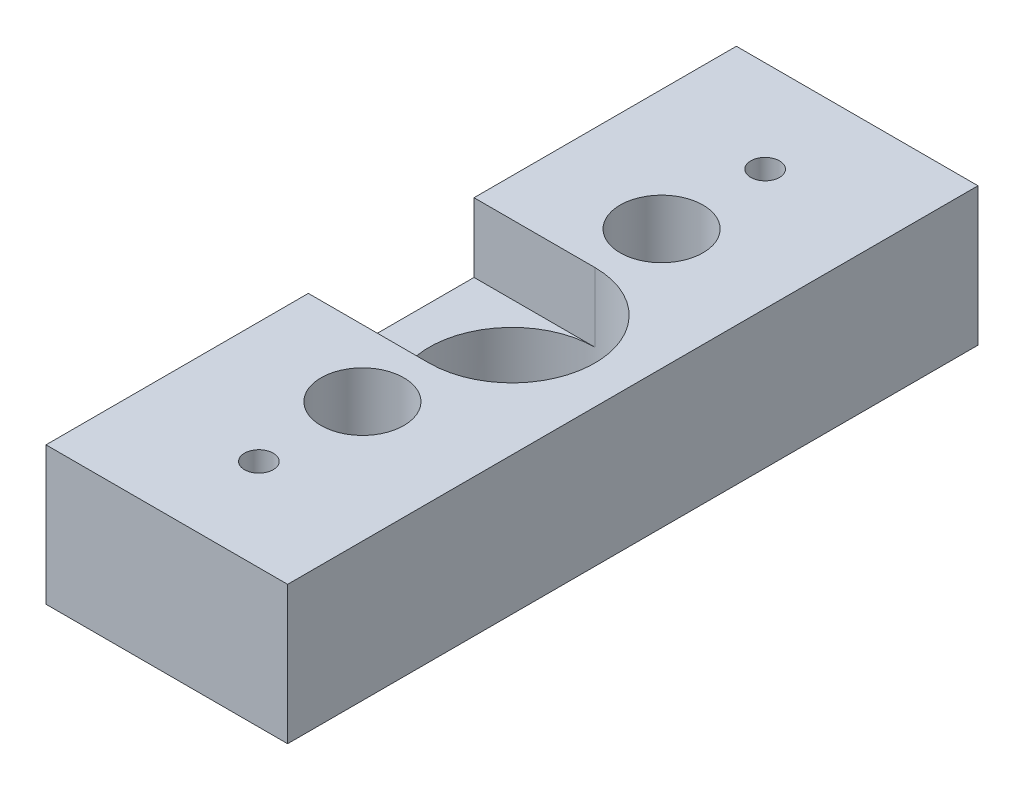
ISO-10303-21;
HEADER;
FILE_DESCRIPTION(('STEP AP214'),'2;1');
FILE_NAME('part.step','',(''),(''),'','','');
FILE_SCHEMA(('AUTOMOTIVE_DESIGN { 1 0 10303 214 1 1 1 1 }'));
ENDSEC;
DATA;
#1=APPLICATION_CONTEXT('core data for automotive mechanical design processes');
#2=APPLICATION_PROTOCOL_DEFINITION('international standard','automotive_design',2000,#1);
#3=PRODUCT_CONTEXT('',#1,'mechanical');
#4=PRODUCT('Part','Part','',(#3));
#5=PRODUCT_RELATED_PRODUCT_CATEGORY('part','',(#4));
#6=PRODUCT_DEFINITION_FORMATION('','',#4);
#7=PRODUCT_DEFINITION_CONTEXT('part definition',#1,'design');
#8=PRODUCT_DEFINITION('design','',#6,#7);
#9=PRODUCT_DEFINITION_SHAPE('','',#8);
#10=(LENGTH_UNIT() NAMED_UNIT(*) SI_UNIT(.MILLI.,.METRE.));
#11=(NAMED_UNIT(*) PLANE_ANGLE_UNIT() SI_UNIT($,.RADIAN.));
#12=(NAMED_UNIT(*) SI_UNIT($,.STERADIAN.) SOLID_ANGLE_UNIT());
#13=UNCERTAINTY_MEASURE_WITH_UNIT(LENGTH_MEASURE(1.E-05),#10,'distance_accuracy_value','');
#14=(GEOMETRIC_REPRESENTATION_CONTEXT(3) GLOBAL_UNCERTAINTY_ASSIGNED_CONTEXT((#13)) GLOBAL_UNIT_ASSIGNED_CONTEXT((#10,
#11,#12)) REPRESENTATION_CONTEXT('',''));
#15=CARTESIAN_POINT('',(0.,0.,0.));
#16=DIRECTION('',(0.,0.,1.));
#17=DIRECTION('',(1.,0.,0.));
#18=AXIS2_PLACEMENT_3D('',#15,#16,#17);
#19=CARTESIAN_POINT('',(0.750000000000003,0.,-2.));
#20=DIRECTION('',(0.,1.,0.));
#21=DIRECTION('',(0.,0.,1.));
#22=AXIS2_PLACEMENT_3D('',#19,#20,#21);
#23=CYLINDRICAL_SURFACE('',#22,3.6);
#24=CARTESIAN_POINT('',(0.750000000000003,0.,-2.));
#25=DIRECTION('',(0.,1.,0.));
#26=DIRECTION('',(0.,0.,1.));
#27=AXIS2_PLACEMENT_3D('',#24,#25,#26);
#28=CIRCLE('',#27,3.6);
#29=CARTESIAN_POINT('',(0.750000000000003,0.,1.6));
#30=VERTEX_POINT('',#29);
#31=EDGE_CURVE('E156',#30,#30,#28,.T.);
#32=ORIENTED_EDGE('',*,*,#31,.F.);
#33=EDGE_LOOP('',(#32));
#34=FACE_BOUND('',#33,.T.);
#35=DIRECTION('',(0.,1.,0.));
#36=VECTOR('',#35,1.);
#37=CARTESIAN_POINT('',(0.750000000000003,3.,1.6));
#38=LINE('',#37,#36);
#39=CARTESIAN_POINT('',(0.750000000000003,3.,1.6));
#40=VERTEX_POINT('',#39);
#41=CARTESIAN_POINT('',(0.750000000000003,6.,1.6));
#42=VERTEX_POINT('',#41);
#43=EDGE_CURVE('E160',#40,#42,#38,.T.);
#44=ORIENTED_EDGE('',*,*,#43,.T.);
#45=CARTESIAN_POINT('',(0.750000000000003,6.,-2.));
#46=DIRECTION('',(0.,1.,0.));
#47=DIRECTION('',(0.,0.,1.));
#48=AXIS2_PLACEMENT_3D('',#45,#46,#47);
#49=CIRCLE('',#48,3.6);
#50=CARTESIAN_POINT('',(0.750000000000003,6.,-5.6));
#51=VERTEX_POINT('',#50);
#52=EDGE_CURVE('E157',#42,#51,#49,.T.);
#53=ORIENTED_EDGE('',*,*,#52,.T.);
#54=DIRECTION('',(0.,1.,0.));
#55=VECTOR('',#54,1.);
#56=CARTESIAN_POINT('',(0.750000000000003,3.,-5.6));
#57=LINE('',#56,#55);
#58=CARTESIAN_POINT('',(0.750000000000003,3.,-5.6));
#59=VERTEX_POINT('',#58);
#60=EDGE_CURVE('E163',#59,#51,#57,.T.);
#61=ORIENTED_EDGE('',*,*,#60,.F.);
#62=CARTESIAN_POINT('',(0.750000000000003,3.,-2.));
#63=DIRECTION('',(0.,1.,0.));
#64=DIRECTION('',(0.,0.,1.));
#65=AXIS2_PLACEMENT_3D('',#62,#63,#64);
#66=CIRCLE('',#65,3.6);
#67=EDGE_CURVE('E11',#40,#59,#66,.F.);
#68=ORIENTED_EDGE('',*,*,#67,.F.);
#69=EDGE_LOOP('',(#44,#53,#61,#68));
#70=FACE_BOUND('',#69,.T.);
#71=ADVANCED_FACE('F43',(#34,#70),#23,.F.);
#72=CARTESIAN_POINT('',(6.,6.,13.));
#73=DIRECTION('',(0.,0.,-1.));
#74=DIRECTION('',(-1.,0.,0.));
#75=AXIS2_PLACEMENT_3D('',#72,#73,#74);
#76=PLANE('',#75);
#77=DIRECTION('',(1.,0.,0.));
#78=VECTOR('',#77,1.);
#79=CARTESIAN_POINT('',(6.,0.,13.));
#80=LINE('',#79,#78);
#81=CARTESIAN_POINT('',(-4.5,0.,13.));
#82=VERTEX_POINT('',#81);
#83=CARTESIAN_POINT('',(6.,0.,13.));
#84=VERTEX_POINT('',#83);
#85=EDGE_CURVE('E79',#82,#84,#80,.T.);
#86=ORIENTED_EDGE('',*,*,#85,.T.);
#87=DIRECTION('',(0.,-1.,0.));
#88=VECTOR('',#87,1.);
#89=CARTESIAN_POINT('',(6.,6.,13.));
#90=LINE('',#89,#88);
#91=CARTESIAN_POINT('',(6.,6.,13.));
#92=VERTEX_POINT('',#91);
#93=EDGE_CURVE('E81',#92,#84,#90,.T.);
#94=ORIENTED_EDGE('',*,*,#93,.F.);
#95=DIRECTION('',(1.,0.,0.));
#96=VECTOR('',#95,1.);
#97=CARTESIAN_POINT('',(6.,6.,13.));
#98=LINE('',#97,#96);
#99=CARTESIAN_POINT('',(-4.5,6.,13.));
#100=VERTEX_POINT('',#99);
#101=EDGE_CURVE('E66',#100,#92,#98,.T.);
#102=ORIENTED_EDGE('',*,*,#101,.F.);
#103=DIRECTION('',(0.,-1.,0.));
#104=VECTOR('',#103,1.);
#105=CARTESIAN_POINT('',(-4.5,6.,13.));
#106=LINE('',#105,#104);
#107=EDGE_CURVE('E51',#100,#82,#106,.T.);
#108=ORIENTED_EDGE('',*,*,#107,.T.);
#109=EDGE_LOOP('',(#86,#94,#102,#108));
#110=FACE_BOUND('',#109,.T.);
#111=ADVANCED_FACE('F45',(#110),#76,.F.);
#112=CARTESIAN_POINT('',(6.,6.,-2.));
#113=DIRECTION('',(-1.,0.,0.));
#114=DIRECTION('',(0.,0.,1.));
#115=AXIS2_PLACEMENT_3D('',#112,#113,#114);
#116=PLANE('',#115);
#117=DIRECTION('',(0.,0.,-1.));
#118=VECTOR('',#117,1.);
#119=CARTESIAN_POINT('',(6.,0.,-2.));
#120=LINE('',#119,#118);
#121=CARTESIAN_POINT('',(6.,0.,-17.));
#122=VERTEX_POINT('',#121);
#123=EDGE_CURVE('E87',#84,#122,#120,.T.);
#124=ORIENTED_EDGE('',*,*,#123,.T.);
#125=DIRECTION('',(0.,-1.,0.));
#126=VECTOR('',#125,1.);
#127=CARTESIAN_POINT('',(6.,6.,-17.));
#128=LINE('',#127,#126);
#129=CARTESIAN_POINT('',(6.,6.,-17.));
#130=VERTEX_POINT('',#129);
#131=EDGE_CURVE('E129',#130,#122,#128,.T.);
#132=ORIENTED_EDGE('',*,*,#131,.F.);
#133=DIRECTION('',(0.,0.,-1.));
#134=VECTOR('',#133,1.);
#135=CARTESIAN_POINT('',(6.,6.,-2.));
#136=LINE('',#135,#134);
#137=EDGE_CURVE('E96',#92,#130,#136,.T.);
#138=ORIENTED_EDGE('',*,*,#137,.F.);
#139=ORIENTED_EDGE('',*,*,#93,.T.);
#140=EDGE_LOOP('',(#124,#132,#138,#139));
#141=FACE_BOUND('',#140,.T.);
#142=ADVANCED_FACE('F92',(#141),#116,.F.);
#143=CARTESIAN_POINT('',(-4.5,6.,-2.));
#144=DIRECTION('',(1.,0.,0.));
#145=DIRECTION('',(0.,0.,-1.));
#146=AXIS2_PLACEMENT_3D('',#143,#144,#145);
#147=PLANE('',#146);
#148=DIRECTION('',(0.,0.,1.));
#149=VECTOR('',#148,1.);
#150=CARTESIAN_POINT('',(-4.5,6.,2.));
#151=LINE('',#150,#149);
#152=CARTESIAN_POINT('',(-4.5,6.,1.6));
#153=VERTEX_POINT('',#152);
#154=EDGE_CURVE('E104',#153,#100,#151,.T.);
#155=ORIENTED_EDGE('',*,*,#154,.F.);
#156=DIRECTION('',(0.,1.,0.));
#157=VECTOR('',#156,1.);
#158=CARTESIAN_POINT('',(-4.5,3.,1.6));
#159=LINE('',#158,#157);
#160=CARTESIAN_POINT('',(-4.5,3.,1.6));
#161=VERTEX_POINT('',#160);
#162=EDGE_CURVE('E169',#161,#153,#159,.T.);
#163=ORIENTED_EDGE('',*,*,#162,.F.);
#164=DIRECTION('',(0.,0.,1.));
#165=VECTOR('',#164,1.);
#166=CARTESIAN_POINT('',(-4.5,3.,-5.6));
#167=LINE('',#166,#165);
#168=CARTESIAN_POINT('',(-4.5,3.,-5.6));
#169=VERTEX_POINT('',#168);
#170=EDGE_CURVE('E182',#169,#161,#167,.T.);
#171=ORIENTED_EDGE('',*,*,#170,.F.);
#172=DIRECTION('',(0.,1.,0.));
#173=VECTOR('',#172,1.);
#174=CARTESIAN_POINT('',(-4.5,3.,-5.6));
#175=LINE('',#174,#173);
#176=CARTESIAN_POINT('',(-4.5,6.,-5.6));
#177=VERTEX_POINT('',#176);
#178=EDGE_CURVE('E166',#169,#177,#175,.T.);
#179=ORIENTED_EDGE('',*,*,#178,.T.);
#180=CARTESIAN_POINT('',(-4.5,6.,-17.));
#181=VERTEX_POINT('',#180);
#182=EDGE_CURVE('E109',#181,#177,#151,.T.);
#183=ORIENTED_EDGE('',*,*,#182,.F.);
#184=DIRECTION('',(0.,-1.,0.));
#185=VECTOR('',#184,1.);
#186=CARTESIAN_POINT('',(-4.5,6.,-17.));
#187=LINE('',#186,#185);
#188=CARTESIAN_POINT('',(-4.5,0.,-17.));
#189=VERTEX_POINT('',#188);
#190=EDGE_CURVE('E131',#181,#189,#187,.T.);
#191=ORIENTED_EDGE('',*,*,#190,.T.);
#192=DIRECTION('',(0.,0.,1.));
#193=VECTOR('',#192,1.);
#194=CARTESIAN_POINT('',(-4.5,0.,-2.));
#195=LINE('',#194,#193);
#196=EDGE_CURVE('E102',#189,#82,#195,.T.);
#197=ORIENTED_EDGE('',*,*,#196,.T.);
#198=ORIENTED_EDGE('',*,*,#107,.F.);
#199=EDGE_LOOP('',(#155,#163,#171,#179,#183,#191,#197,#198));
#200=FACE_BOUND('',#199,.T.);
#201=ADVANCED_FACE('F199',(#200),#147,.F.);
#202=CARTESIAN_POINT('',(0.,6.,0.));
#203=DIRECTION('',(0.,-1.,0.));
#204=DIRECTION('',(0.,0.,-1.));
#205=AXIS2_PLACEMENT_3D('',#202,#203,#204);
#206=PLANE('',#205);
#207=CARTESIAN_POINT('',(0.750000000000003,6.,-13.));
#208=DIRECTION('',(0.,1.,0.));
#209=DIRECTION('',(0.,0.,1.));
#210=AXIS2_PLACEMENT_3D('',#207,#208,#209);
#211=CIRCLE('',#210,0.624999999999988);
#212=CARTESIAN_POINT('',(0.750000000000003,6.,-12.375));
#213=VERTEX_POINT('',#212);
#214=EDGE_CURVE('E153',#213,#213,#211,.T.);
#215=ORIENTED_EDGE('',*,*,#214,.F.);
#216=EDGE_LOOP('',(#215));
#217=FACE_BOUND('',#216,.T.);
#218=CARTESIAN_POINT('',(0.750000000000002,6.,-8.5));
#219=DIRECTION('',(0.,1.,0.));
#220=DIRECTION('',(0.,0.,1.));
#221=AXIS2_PLACEMENT_3D('',#218,#219,#220);
#222=CIRCLE('',#221,1.8);
#223=CARTESIAN_POINT('',(0.750000000000002,6.,-6.7));
#224=VERTEX_POINT('',#223);
#225=EDGE_CURVE('E147',#224,#224,#222,.T.);
#226=ORIENTED_EDGE('',*,*,#225,.F.);
#227=EDGE_LOOP('',(#226));
#228=FACE_BOUND('',#227,.T.);
#229=CARTESIAN_POINT('',(0.750000000000003,6.,9.));
#230=DIRECTION('',(0.,1.,0.));
#231=DIRECTION('',(0.,0.,1.));
#232=AXIS2_PLACEMENT_3D('',#229,#230,#231);
#233=CIRCLE('',#232,0.624999999999988);
#234=CARTESIAN_POINT('',(0.750000000000003,6.,9.62499999999999));
#235=VERTEX_POINT('',#234);
#236=EDGE_CURVE('E126',#235,#235,#233,.T.);
#237=ORIENTED_EDGE('',*,*,#236,.F.);
#238=EDGE_LOOP('',(#237));
#239=FACE_BOUND('',#238,.T.);
#240=CARTESIAN_POINT('',(0.750000000000002,6.,4.5));
#241=DIRECTION('',(0.,1.,0.));
#242=DIRECTION('',(0.,0.,1.));
#243=AXIS2_PLACEMENT_3D('',#240,#241,#242);
#244=CIRCLE('',#243,1.8);
#245=CARTESIAN_POINT('',(0.750000000000002,6.,6.3));
#246=VERTEX_POINT('',#245);
#247=EDGE_CURVE('E120',#246,#246,#244,.T.);
#248=ORIENTED_EDGE('',*,*,#247,.F.);
#249=EDGE_LOOP('',(#248));
#250=FACE_BOUND('',#249,.T.);
#251=ORIENTED_EDGE('',*,*,#52,.F.);
#252=DIRECTION('',(1.,0.,0.));
#253=VECTOR('',#252,1.);
#254=CARTESIAN_POINT('',(-4.5,6.,1.6));
#255=LINE('',#254,#253);
#256=EDGE_CURVE('E174',#153,#42,#255,.T.);
#257=ORIENTED_EDGE('',*,*,#256,.F.);
#258=ORIENTED_EDGE('',*,*,#154,.T.);
#259=ORIENTED_EDGE('',*,*,#101,.T.);
#260=ORIENTED_EDGE('',*,*,#137,.T.);
#261=DIRECTION('',(1.,0.,0.));
#262=VECTOR('',#261,1.);
#263=CARTESIAN_POINT('',(6.,6.,-17.));
#264=LINE('',#263,#262);
#265=EDGE_CURVE('E134',#181,#130,#264,.T.);
#266=ORIENTED_EDGE('',*,*,#265,.F.);
#267=ORIENTED_EDGE('',*,*,#182,.T.);
#268=DIRECTION('',(-1.,0.,0.));
#269=VECTOR('',#268,1.);
#270=CARTESIAN_POINT('',(0.750000000000003,6.,-5.6));
#271=LINE('',#270,#269);
#272=EDGE_CURVE('E178',#51,#177,#271,.T.);
#273=ORIENTED_EDGE('',*,*,#272,.F.);
#274=EDGE_LOOP('',(#251,#257,#258,#259,#260,#266,#267,#273));
#275=FACE_BOUND('',#274,.T.);
#276=ADVANCED_FACE('F210',(#217,#228,#239,#250,#275),#206,.F.);
#277=CARTESIAN_POINT('',(0.,0.,0.));
#278=DIRECTION('',(0.,-1.,0.));
#279=DIRECTION('',(0.,0.,-1.));
#280=AXIS2_PLACEMENT_3D('',#277,#278,#279);
#281=PLANE('',#280);
#282=ORIENTED_EDGE('',*,*,#31,.T.);
#283=EDGE_LOOP('',(#282));
#284=FACE_BOUND('',#283,.T.);
#285=CARTESIAN_POINT('',(0.750000000000003,0.,-13.));
#286=DIRECTION('',(0.,1.,0.));
#287=DIRECTION('',(0.,0.,1.));
#288=AXIS2_PLACEMENT_3D('',#285,#286,#287);
#289=CIRCLE('',#288,0.624999999999997);
#290=CARTESIAN_POINT('',(0.750000000000003,0.,-12.375));
#291=VERTEX_POINT('',#290);
#292=EDGE_CURVE('E150',#291,#291,#289,.T.);
#293=ORIENTED_EDGE('',*,*,#292,.T.);
#294=EDGE_LOOP('',(#293));
#295=FACE_BOUND('',#294,.T.);
#296=CARTESIAN_POINT('',(0.750000000000002,0.,-8.5));
#297=DIRECTION('',(0.,1.,0.));
#298=DIRECTION('',(0.,0.,1.));
#299=AXIS2_PLACEMENT_3D('',#296,#297,#298);
#300=CIRCLE('',#299,0.9);
#301=CARTESIAN_POINT('',(0.750000000000002,0.,-7.6));
#302=VERTEX_POINT('',#301);
#303=EDGE_CURVE('E136',#302,#302,#300,.T.);
#304=ORIENTED_EDGE('',*,*,#303,.T.);
#305=EDGE_LOOP('',(#304));
#306=FACE_BOUND('',#305,.T.);
#307=CARTESIAN_POINT('',(0.750000000000003,0.,9.));
#308=DIRECTION('',(0.,1.,0.));
#309=DIRECTION('',(0.,0.,1.));
#310=AXIS2_PLACEMENT_3D('',#307,#308,#309);
#311=CIRCLE('',#310,0.624999999999997);
#312=CARTESIAN_POINT('',(0.750000000000003,0.,9.62499999999999));
#313=VERTEX_POINT('',#312);
#314=EDGE_CURVE('E123',#313,#313,#311,.T.);
#315=ORIENTED_EDGE('',*,*,#314,.T.);
#316=EDGE_LOOP('',(#315));
#317=FACE_BOUND('',#316,.T.);
#318=CARTESIAN_POINT('',(0.750000000000002,0.,4.5));
#319=DIRECTION('',(0.,1.,0.));
#320=DIRECTION('',(0.,0.,1.));
#321=AXIS2_PLACEMENT_3D('',#318,#319,#320);
#322=CIRCLE('',#321,0.9);
#323=CARTESIAN_POINT('',(0.750000000000002,0.,5.4));
#324=VERTEX_POINT('',#323);
#325=EDGE_CURVE('E88',#324,#324,#322,.T.);
#326=ORIENTED_EDGE('',*,*,#325,.T.);
#327=EDGE_LOOP('',(#326));
#328=FACE_BOUND('',#327,.T.);
#329=ORIENTED_EDGE('',*,*,#85,.F.);
#330=ORIENTED_EDGE('',*,*,#196,.F.);
#331=DIRECTION('',(1.,0.,0.));
#332=VECTOR('',#331,1.);
#333=CARTESIAN_POINT('',(6.,0.,-17.));
#334=LINE('',#333,#332);
#335=EDGE_CURVE('E101',#189,#122,#334,.T.);
#336=ORIENTED_EDGE('',*,*,#335,.T.);
#337=ORIENTED_EDGE('',*,*,#123,.F.);
#338=EDGE_LOOP('',(#329,#330,#336,#337));
#339=FACE_BOUND('',#338,.T.);
#340=ADVANCED_FACE('F99',(#284,#295,#306,#317,#328,#339),#281,.T.);
#341=CARTESIAN_POINT('',(0.750000000000002,6.,4.5));
#342=DIRECTION('',(0.,1.,0.));
#343=DIRECTION('',(0.,0.,1.));
#344=AXIS2_PLACEMENT_3D('',#341,#342,#343);
#345=CYLINDRICAL_SURFACE('',#344,0.9);
#346=ORIENTED_EDGE('',*,*,#325,.F.);
#347=EDGE_LOOP('',(#346));
#348=FACE_BOUND('',#347,.T.);
#349=CARTESIAN_POINT('',(0.750000000000002,1.1,4.5));
#350=DIRECTION('',(0.,1.,0.));
#351=DIRECTION('',(0.,0.,1.));
#352=AXIS2_PLACEMENT_3D('',#349,#350,#351);
#353=CIRCLE('',#352,0.9);
#354=CARTESIAN_POINT('',(0.750000000000002,1.1,5.4));
#355=VERTEX_POINT('',#354);
#356=EDGE_CURVE('E114',#355,#355,#353,.T.);
#357=ORIENTED_EDGE('',*,*,#356,.T.);
#358=EDGE_LOOP('',(#357));
#359=FACE_BOUND('',#358,.T.);
#360=ADVANCED_FACE('F284',(#348,#359),#345,.F.);
#361=CARTESIAN_POINT('',(0.750000000000002,2.,4.5));
#362=DIRECTION('',(0.,1.,0.));
#363=DIRECTION('',(0.,0.,1.));
#364=AXIS2_PLACEMENT_3D('',#361,#362,#363);
#365=CONICAL_SURFACE('',#364,1.8,0.785398163397449);
#366=ORIENTED_EDGE('',*,*,#356,.F.);
#367=EDGE_LOOP('',(#366));
#368=FACE_BOUND('',#367,.T.);
#369=CARTESIAN_POINT('',(0.750000000000002,2.,4.5));
#370=DIRECTION('',(0.,1.,0.));
#371=DIRECTION('',(0.,0.,1.));
#372=AXIS2_PLACEMENT_3D('',#369,#370,#371);
#373=CIRCLE('',#372,1.8);
#374=CARTESIAN_POINT('',(0.750000000000002,2.,6.3));
#375=VERTEX_POINT('',#374);
#376=EDGE_CURVE('E117',#375,#375,#373,.T.);
#377=ORIENTED_EDGE('',*,*,#376,.T.);
#378=EDGE_LOOP('',(#377));
#379=FACE_BOUND('',#378,.T.);
#380=ADVANCED_FACE('F278',(#368,#379),#365,.F.);
#381=CARTESIAN_POINT('',(0.750000000000002,6.,4.5));
#382=DIRECTION('',(0.,1.,0.));
#383=DIRECTION('',(0.,0.,1.));
#384=AXIS2_PLACEMENT_3D('',#381,#382,#383);
#385=CYLINDRICAL_SURFACE('',#384,1.8);
#386=ORIENTED_EDGE('',*,*,#376,.F.);
#387=EDGE_LOOP('',(#386));
#388=FACE_BOUND('',#387,.T.);
#389=ORIENTED_EDGE('',*,*,#247,.T.);
#390=EDGE_LOOP('',(#389));
#391=FACE_BOUND('',#390,.T.);
#392=ADVANCED_FACE('F237',(#388,#391),#385,.F.);
#393=CARTESIAN_POINT('',(0.750000000000003,6.,9.));
#394=DIRECTION('',(0.,1.,0.));
#395=DIRECTION('',(0.,0.,1.));
#396=AXIS2_PLACEMENT_3D('',#393,#394,#395);
#397=CYLINDRICAL_SURFACE('',#396,0.624999999999993);
#398=ORIENTED_EDGE('',*,*,#314,.F.);
#399=EDGE_LOOP('',(#398));
#400=FACE_BOUND('',#399,.T.);
#401=ORIENTED_EDGE('',*,*,#236,.T.);
#402=EDGE_LOOP('',(#401));
#403=FACE_BOUND('',#402,.T.);
#404=ADVANCED_FACE('F228',(#400,#403),#397,.F.);
#405=CARTESIAN_POINT('',(6.,6.,-17.));
#406=DIRECTION('',(0.,0.,-1.));
#407=DIRECTION('',(-1.,0.,0.));
#408=AXIS2_PLACEMENT_3D('',#405,#406,#407);
#409=PLANE('',#408);
#410=ORIENTED_EDGE('',*,*,#335,.F.);
#411=ORIENTED_EDGE('',*,*,#190,.F.);
#412=ORIENTED_EDGE('',*,*,#265,.T.);
#413=ORIENTED_EDGE('',*,*,#131,.T.);
#414=EDGE_LOOP('',(#410,#411,#412,#413));
#415=FACE_BOUND('',#414,.T.);
#416=ADVANCED_FACE('F225',(#415),#409,.T.);
#417=CARTESIAN_POINT('',(0.750000000000002,6.,-8.5));
#418=DIRECTION('',(0.,1.,0.));
#419=DIRECTION('',(0.,0.,1.));
#420=AXIS2_PLACEMENT_3D('',#417,#418,#419);
#421=CYLINDRICAL_SURFACE('',#420,0.9);
#422=ORIENTED_EDGE('',*,*,#303,.F.);
#423=EDGE_LOOP('',(#422));
#424=FACE_BOUND('',#423,.T.);
#425=CARTESIAN_POINT('',(0.750000000000002,1.1,-8.5));
#426=DIRECTION('',(0.,1.,0.));
#427=DIRECTION('',(0.,0.,1.));
#428=AXIS2_PLACEMENT_3D('',#425,#426,#427);
#429=CIRCLE('',#428,0.9);
#430=CARTESIAN_POINT('',(0.750000000000002,1.1,-7.6));
#431=VERTEX_POINT('',#430);
#432=EDGE_CURVE('E141',#431,#431,#429,.T.);
#433=ORIENTED_EDGE('',*,*,#432,.T.);
#434=EDGE_LOOP('',(#433));
#435=FACE_BOUND('',#434,.T.);
#436=ADVANCED_FACE('F227',(#424,#435),#421,.F.);
#437=CARTESIAN_POINT('',(0.750000000000002,2.,-8.5));
#438=DIRECTION('',(0.,1.,0.));
#439=DIRECTION('',(0.,0.,1.));
#440=AXIS2_PLACEMENT_3D('',#437,#438,#439);
#441=CONICAL_SURFACE('',#440,1.8,0.785398163397449);
#442=ORIENTED_EDGE('',*,*,#432,.F.);
#443=EDGE_LOOP('',(#442));
#444=FACE_BOUND('',#443,.T.);
#445=CARTESIAN_POINT('',(0.750000000000002,2.,-8.5));
#446=DIRECTION('',(0.,1.,0.));
#447=DIRECTION('',(0.,0.,1.));
#448=AXIS2_PLACEMENT_3D('',#445,#446,#447);
#449=CIRCLE('',#448,1.8);
#450=CARTESIAN_POINT('',(0.750000000000002,2.,-6.70000000000001));
#451=VERTEX_POINT('',#450);
#452=EDGE_CURVE('E144',#451,#451,#449,.T.);
#453=ORIENTED_EDGE('',*,*,#452,.T.);
#454=EDGE_LOOP('',(#453));
#455=FACE_BOUND('',#454,.T.);
#456=ADVANCED_FACE('F234',(#444,#455),#441,.F.);
#457=CARTESIAN_POINT('',(0.750000000000002,6.,-8.5));
#458=DIRECTION('',(0.,1.,0.));
#459=DIRECTION('',(0.,0.,1.));
#460=AXIS2_PLACEMENT_3D('',#457,#458,#459);
#461=CYLINDRICAL_SURFACE('',#460,1.8);
#462=ORIENTED_EDGE('',*,*,#452,.F.);
#463=EDGE_LOOP('',(#462));
#464=FACE_BOUND('',#463,.T.);
#465=ORIENTED_EDGE('',*,*,#225,.T.);
#466=EDGE_LOOP('',(#465));
#467=FACE_BOUND('',#466,.T.);
#468=ADVANCED_FACE('F254',(#464,#467),#461,.F.);
#469=CARTESIAN_POINT('',(0.750000000000003,6.,-13.));
#470=DIRECTION('',(0.,1.,0.));
#471=DIRECTION('',(0.,0.,1.));
#472=AXIS2_PLACEMENT_3D('',#469,#470,#471);
#473=CYLINDRICAL_SURFACE('',#472,0.624999999999993);
#474=ORIENTED_EDGE('',*,*,#292,.F.);
#475=EDGE_LOOP('',(#474));
#476=FACE_BOUND('',#475,.T.);
#477=ORIENTED_EDGE('',*,*,#214,.T.);
#478=EDGE_LOOP('',(#477));
#479=FACE_BOUND('',#478,.T.);
#480=ADVANCED_FACE('F251',(#476,#479),#473,.F.);
#481=CARTESIAN_POINT('',(0.,3.,0.));
#482=DIRECTION('',(0.,1.,0.));
#483=DIRECTION('',(0.,0.,1.));
#484=AXIS2_PLACEMENT_3D('',#481,#482,#483);
#485=PLANE('',#484);
#486=ORIENTED_EDGE('',*,*,#67,.T.);
#487=DIRECTION('',(-1.,0.,0.));
#488=VECTOR('',#487,1.);
#489=CARTESIAN_POINT('',(0.750000000000003,3.,-5.6));
#490=LINE('',#489,#488);
#491=EDGE_CURVE('E177',#59,#169,#490,.T.);
#492=ORIENTED_EDGE('',*,*,#491,.T.);
#493=ORIENTED_EDGE('',*,*,#170,.T.);
#494=DIRECTION('',(1.,0.,0.));
#495=VECTOR('',#494,1.);
#496=CARTESIAN_POINT('',(-4.5,3.,1.6));
#497=LINE('',#496,#495);
#498=EDGE_CURVE('E57',#161,#40,#497,.T.);
#499=ORIENTED_EDGE('',*,*,#498,.T.);
#500=EDGE_LOOP('',(#486,#492,#493,#499));
#501=FACE_BOUND('',#500,.T.);
#502=ADVANCED_FACE('F188',(#501),#485,.T.);
#503=CARTESIAN_POINT('',(-4.5,3.,1.6));
#504=DIRECTION('',(0.,0.,1.));
#505=DIRECTION('',(1.,0.,0.));
#506=AXIS2_PLACEMENT_3D('',#503,#504,#505);
#507=PLANE('',#506);
#508=ORIENTED_EDGE('',*,*,#256,.T.);
#509=ORIENTED_EDGE('',*,*,#43,.F.);
#510=ORIENTED_EDGE('',*,*,#498,.F.);
#511=ORIENTED_EDGE('',*,*,#162,.T.);
#512=EDGE_LOOP('',(#508,#509,#510,#511));
#513=FACE_BOUND('',#512,.T.);
#514=ADVANCED_FACE('F206',(#513),#507,.F.);
#515=CARTESIAN_POINT('',(0.750000000000003,3.,-5.6));
#516=DIRECTION('',(0.,0.,-1.));
#517=DIRECTION('',(-1.,0.,0.));
#518=AXIS2_PLACEMENT_3D('',#515,#516,#517);
#519=PLANE('',#518);
#520=ORIENTED_EDGE('',*,*,#272,.T.);
#521=ORIENTED_EDGE('',*,*,#178,.F.);
#522=ORIENTED_EDGE('',*,*,#491,.F.);
#523=ORIENTED_EDGE('',*,*,#60,.T.);
#524=EDGE_LOOP('',(#520,#521,#522,#523));
#525=FACE_BOUND('',#524,.T.);
#526=ADVANCED_FACE('F249',(#525),#519,.F.);
#527=CLOSED_SHELL('',(#71,#111,#142,#201,#276,#340,#360,#380,#392,#404,#416,#436,#456,#468,#480,
#502,#514,#526));
#528=MANIFOLD_SOLID_BREP('B2',#527);
#529=ADVANCED_BREP_SHAPE_REPRESENTATION('',(#18,#528),#14);
#530=SHAPE_DEFINITION_REPRESENTATION(#9,#529);
ENDSEC;
END-ISO-10303-21;
